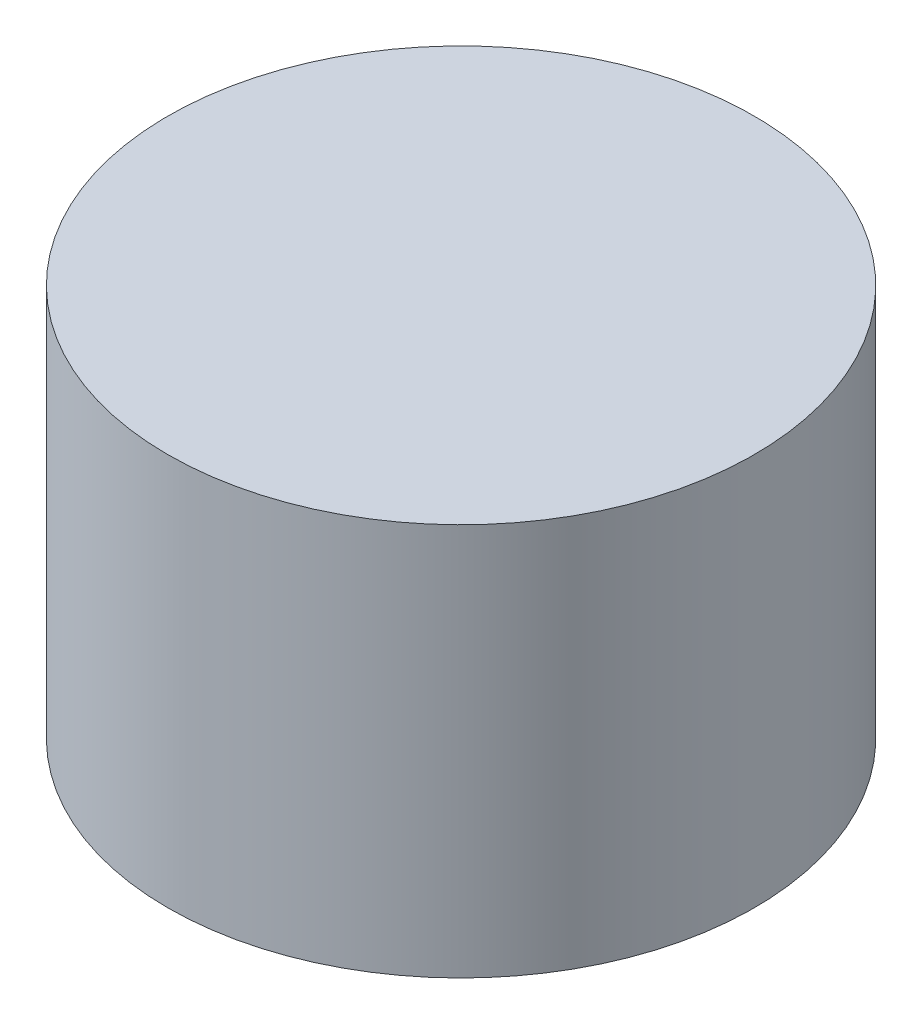
ISO-10303-21;
HEADER;
FILE_DESCRIPTION(('STEP AP214'),'2;1');
FILE_NAME('part.step','',(''),(''),'','','');
FILE_SCHEMA(('AUTOMOTIVE_DESIGN { 1 0 10303 214 1 1 1 1 }'));
ENDSEC;
DATA;
#1=APPLICATION_CONTEXT('core data for automotive mechanical design processes');
#2=APPLICATION_PROTOCOL_DEFINITION('international standard','automotive_design',2000,#1);
#3=PRODUCT_CONTEXT('',#1,'mechanical');
#4=PRODUCT('Part','Part','',(#3));
#5=PRODUCT_RELATED_PRODUCT_CATEGORY('part','',(#4));
#6=PRODUCT_DEFINITION_FORMATION('','',#4);
#7=PRODUCT_DEFINITION_CONTEXT('part definition',#1,'design');
#8=PRODUCT_DEFINITION('design','',#6,#7);
#9=PRODUCT_DEFINITION_SHAPE('','',#8);
#10=(LENGTH_UNIT() NAMED_UNIT(*) SI_UNIT(.MILLI.,.METRE.));
#11=(NAMED_UNIT(*) PLANE_ANGLE_UNIT() SI_UNIT($,.RADIAN.));
#12=(NAMED_UNIT(*) SI_UNIT($,.STERADIAN.) SOLID_ANGLE_UNIT());
#13=UNCERTAINTY_MEASURE_WITH_UNIT(LENGTH_MEASURE(1.E-05),#10,'distance_accuracy_value','');
#14=(GEOMETRIC_REPRESENTATION_CONTEXT(3) GLOBAL_UNCERTAINTY_ASSIGNED_CONTEXT((#13)) GLOBAL_UNIT_ASSIGNED_CONTEXT((#10,
#11,#12)) REPRESENTATION_CONTEXT('',''));
#15=CARTESIAN_POINT('',(0.,0.,0.));
#16=DIRECTION('',(0.,0.,1.));
#17=DIRECTION('',(1.,0.,0.));
#18=AXIS2_PLACEMENT_3D('',#15,#16,#17);
#19=CARTESIAN_POINT('',(0.,4.25,0.));
#20=DIRECTION('',(0.,-1.,0.));
#21=DIRECTION('',(0.,0.,-1.));
#22=AXIS2_PLACEMENT_3D('',#19,#20,#21);
#23=CYLINDRICAL_SURFACE('',#22,3.175);
#24=CARTESIAN_POINT('',(0.,4.25,0.));
#25=DIRECTION('',(0.,1.,0.));
#26=DIRECTION('',(0.,0.,1.));
#27=AXIS2_PLACEMENT_3D('',#24,#25,#26);
#28=CIRCLE('',#27,3.175);
#29=CARTESIAN_POINT('',(0.,4.25,3.175));
#30=VERTEX_POINT('',#29);
#31=EDGE_CURVE('E10',#30,#30,#28,.T.);
#32=ORIENTED_EDGE('',*,*,#31,.F.);
#33=EDGE_LOOP('',(#32));
#34=FACE_BOUND('',#33,.T.);
#35=CARTESIAN_POINT('',(0.,0.,0.));
#36=DIRECTION('',(0.,1.,0.));
#37=DIRECTION('',(0.,0.,1.));
#38=AXIS2_PLACEMENT_3D('',#35,#36,#37);
#39=CIRCLE('',#38,3.175);
#40=CARTESIAN_POINT('',(0.,0.,3.175));
#41=VERTEX_POINT('',#40);
#42=EDGE_CURVE('E46',#41,#41,#39,.T.);
#43=ORIENTED_EDGE('',*,*,#42,.T.);
#44=EDGE_LOOP('',(#43));
#45=FACE_BOUND('',#44,.T.);
#46=ADVANCED_FACE('F43',(#34,#45),#23,.T.);
#47=CARTESIAN_POINT('',(0.,4.25,0.));
#48=DIRECTION('',(0.,1.,0.));
#49=DIRECTION('',(0.,0.,1.));
#50=AXIS2_PLACEMENT_3D('',#47,#48,#49);
#51=PLANE('',#50);
#52=ORIENTED_EDGE('',*,*,#31,.T.);
#53=EDGE_LOOP('',(#52));
#54=FACE_BOUND('',#53,.T.);
#55=ADVANCED_FACE('F58',(#54),#51,.T.);
#56=CARTESIAN_POINT('',(0.,0.,0.));
#57=DIRECTION('',(0.,1.,0.));
#58=DIRECTION('',(0.,0.,1.));
#59=AXIS2_PLACEMENT_3D('',#56,#57,#58);
#60=PLANE('',#59);
#61=ORIENTED_EDGE('',*,*,#42,.F.);
#62=EDGE_LOOP('',(#61));
#63=FACE_BOUND('',#62,.T.);
#64=ADVANCED_FACE('F59',(#63),#60,.F.);
#65=CLOSED_SHELL('',(#46,#55,#64));
#66=MANIFOLD_SOLID_BREP('B2',#65);
#67=ADVANCED_BREP_SHAPE_REPRESENTATION('',(#18,#66),#14);
#68=SHAPE_DEFINITION_REPRESENTATION(#9,#67);
ENDSEC;
END-ISO-10303-21;
